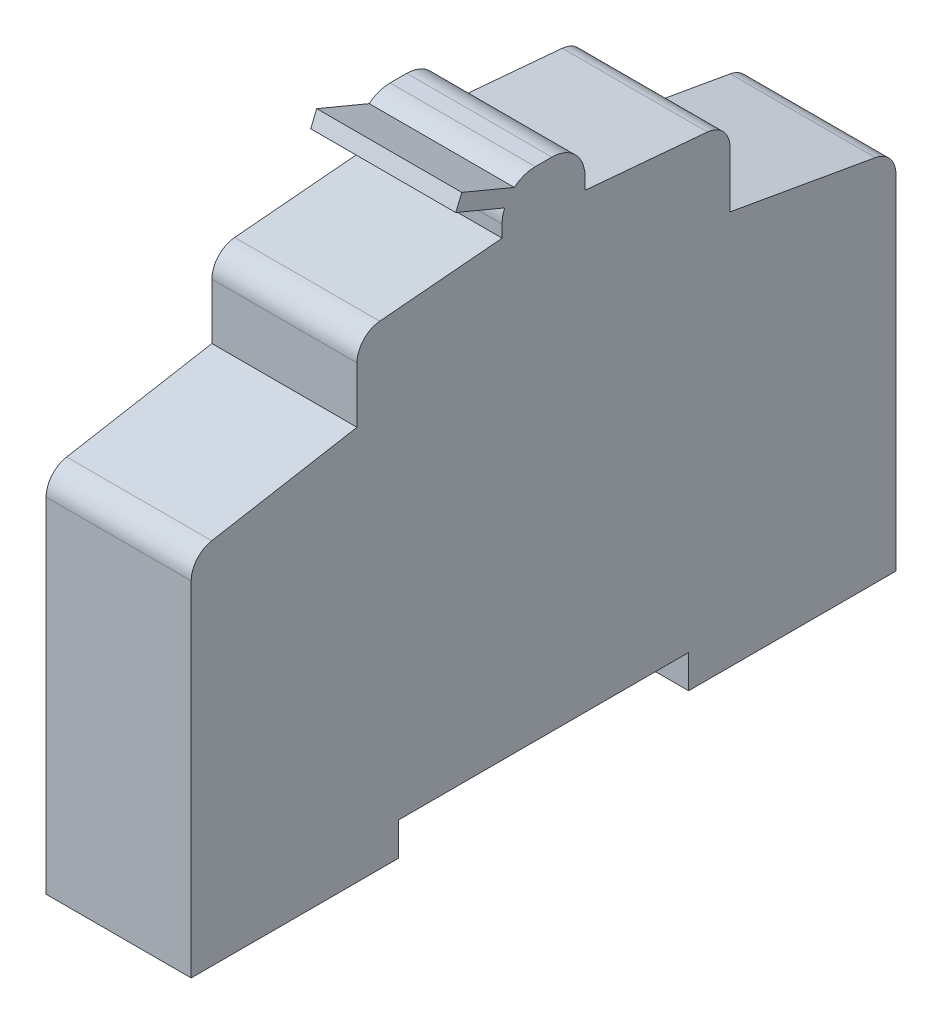
ISO-10303-21;
HEADER;
FILE_DESCRIPTION(('STEP AP214'),'2;1');
FILE_NAME('part.step','',(''),(''),'','','');
FILE_SCHEMA(('AUTOMOTIVE_DESIGN { 1 0 10303 214 1 1 1 1 }'));
ENDSEC;
DATA;
#1=APPLICATION_CONTEXT('core data for automotive mechanical design processes');
#2=APPLICATION_PROTOCOL_DEFINITION('international standard','automotive_design',2000,#1);
#3=PRODUCT_CONTEXT('',#1,'mechanical');
#4=PRODUCT('Part','Part','',(#3));
#5=PRODUCT_RELATED_PRODUCT_CATEGORY('part','',(#4));
#6=PRODUCT_DEFINITION_FORMATION('','',#4);
#7=PRODUCT_DEFINITION_CONTEXT('part definition',#1,'design');
#8=PRODUCT_DEFINITION('design','',#6,#7);
#9=PRODUCT_DEFINITION_SHAPE('','',#8);
#10=(LENGTH_UNIT() NAMED_UNIT(*) SI_UNIT(.MILLI.,.METRE.));
#11=(NAMED_UNIT(*) PLANE_ANGLE_UNIT() SI_UNIT($,.RADIAN.));
#12=(NAMED_UNIT(*) SI_UNIT($,.STERADIAN.) SOLID_ANGLE_UNIT());
#13=UNCERTAINTY_MEASURE_WITH_UNIT(LENGTH_MEASURE(1.E-05),#10,'distance_accuracy_value','');
#14=(GEOMETRIC_REPRESENTATION_CONTEXT(3) GLOBAL_UNCERTAINTY_ASSIGNED_CONTEXT((#13)) GLOBAL_UNIT_ASSIGNED_CONTEXT((#10,
#11,#12)) REPRESENTATION_CONTEXT('',''));
#15=CARTESIAN_POINT('',(0.,0.,0.));
#16=DIRECTION('',(0.,0.,1.));
#17=DIRECTION('',(1.,0.,0.));
#18=AXIS2_PLACEMENT_3D('',#15,#16,#17);
#19=CARTESIAN_POINT('',(0.,0.,0.));
#20=DIRECTION('',(0.,-1.,0.));
#21=DIRECTION('',(0.,0.,-1.));
#22=AXIS2_PLACEMENT_3D('',#19,#20,#21);
#23=PLANE('',#22);
#24=DIRECTION('',(1.,0.,0.));
#25=VECTOR('',#24,1.);
#26=CARTESIAN_POINT('',(-0.001000000000001,0.,-25.));
#27=LINE('',#26,#25);
#28=CARTESIAN_POINT('',(0.,0.,-25.));
#29=VERTEX_POINT('',#28);
#30=CARTESIAN_POINT('',(17.5,0.,-25.));
#31=VERTEX_POINT('',#30);
#32=EDGE_CURVE('E397',#29,#31,#27,.T.);
#33=ORIENTED_EDGE('',*,*,#32,.T.);
#34=DIRECTION('',(0.,0.,-1.));
#35=VECTOR('',#34,1.);
#36=CARTESIAN_POINT('',(17.5,0.,0.));
#37=LINE('',#36,#35);
#38=CARTESIAN_POINT('',(17.5,0.,0.));
#39=VERTEX_POINT('',#38);
#40=EDGE_CURVE('E232',#39,#31,#37,.T.);
#41=ORIENTED_EDGE('',*,*,#40,.F.);
#42=DIRECTION('',(1.,0.,0.));
#43=VECTOR('',#42,1.);
#44=CARTESIAN_POINT('',(0.,0.,0.));
#45=LINE('',#44,#43);
#46=CARTESIAN_POINT('',(0.,0.,0.));
#47=VERTEX_POINT('',#46);
#48=EDGE_CURVE('E233',#47,#39,#45,.T.);
#49=ORIENTED_EDGE('',*,*,#48,.F.);
#50=DIRECTION('',(0.,0.,1.));
#51=VECTOR('',#50,1.);
#52=CARTESIAN_POINT('',(0.,0.,0.));
#53=LINE('',#52,#51);
#54=EDGE_CURVE('E380',#29,#47,#53,.T.);
#55=ORIENTED_EDGE('',*,*,#54,.F.);
#56=EDGE_LOOP('',(#33,#41,#49,#55));
#57=FACE_BOUND('',#56,.T.);
#58=ADVANCED_FACE('F36',(#57),#23,.T.);
#59=CARTESIAN_POINT('',(0.,60.,-41.5));
#60=DIRECTION('',(-1.,0.,0.));
#61=DIRECTION('',(0.,0.,1.));
#62=AXIS2_PLACEMENT_3D('',#59,#60,#61);
#63=CYLINDRICAL_SURFACE('',#62,4.);
#64=DIRECTION('',(-1.,0.,0.));
#65=VECTOR('',#64,1.);
#66=CARTESIAN_POINT('',(0.,63.0996030883576,-38.9716683970167));
#67=LINE('',#66,#65);
#68=CARTESIAN_POINT('',(17.5,63.0996030883576,-38.9716683970167));
#69=VERTEX_POINT('',#68);
#70=CARTESIAN_POINT('',(0.,63.0996030883576,-38.9716683970167));
#71=VERTEX_POINT('',#70);
#72=EDGE_CURVE('E11',#69,#71,#67,.T.);
#73=ORIENTED_EDGE('',*,*,#72,.F.);
#74=CARTESIAN_POINT('',(17.5,60.,-41.5));
#75=DIRECTION('',(-1.,0.,0.));
#76=DIRECTION('',(0.,0.,1.));
#77=AXIS2_PLACEMENT_3D('',#74,#75,#76);
#78=CIRCLE('',#77,4.);
#79=CARTESIAN_POINT('',(17.5,64.,-41.5));
#80=VERTEX_POINT('',#79);
#81=EDGE_CURVE('E331',#80,#69,#78,.F.);
#82=ORIENTED_EDGE('',*,*,#81,.F.);
#83=DIRECTION('',(1.,0.,0.));
#84=VECTOR('',#83,1.);
#85=CARTESIAN_POINT('',(17.5,64.,-41.5));
#86=LINE('',#85,#84);
#87=CARTESIAN_POINT('',(0.,64.,-41.5));
#88=VERTEX_POINT('',#87);
#89=EDGE_CURVE('E325',#88,#80,#86,.T.);
#90=ORIENTED_EDGE('',*,*,#89,.F.);
#91=CARTESIAN_POINT('',(0.,60.,-41.5));
#92=DIRECTION('',(1.,0.,0.));
#93=DIRECTION('',(0.,0.,-1.));
#94=AXIS2_PLACEMENT_3D('',#91,#92,#93);
#95=CIRCLE('',#94,4.);
#96=EDGE_CURVE('E338',#71,#88,#95,.F.);
#97=ORIENTED_EDGE('',*,*,#96,.F.);
#98=EDGE_LOOP('',(#73,#82,#90,#97));
#99=FACE_BOUND('',#98,.T.);
#100=ADVANCED_FACE('F430',(#99),#63,.T.);
#101=CARTESIAN_POINT('',(0.,44.,0.));
#102=DIRECTION('',(1.,0.,0.));
#103=DIRECTION('',(0.,0.,-1.));
#104=AXIS2_PLACEMENT_3D('',#101,#102,#103);
#105=PLANE('',#104);
#106=DIRECTION('',(0.,0.,-1.));
#107=VECTOR('',#106,1.);
#108=CARTESIAN_POINT('',(0.,4.,-60.));
#109=LINE('',#108,#107);
#110=CARTESIAN_POINT('',(0.,4.,-25.));
#111=VERTEX_POINT('',#110);
#112=CARTESIAN_POINT('',(0.,4.,-60.));
#113=VERTEX_POINT('',#112);
#114=EDGE_CURVE('E682',#111,#113,#109,.T.);
#115=ORIENTED_EDGE('',*,*,#114,.F.);
#116=DIRECTION('',(0.,1.,0.));
#117=VECTOR('',#116,1.);
#118=CARTESIAN_POINT('',(0.,4.,-25.));
#119=LINE('',#118,#117);
#120=EDGE_CURVE('E226',#29,#111,#119,.T.);
#121=ORIENTED_EDGE('',*,*,#120,.F.);
#122=ORIENTED_EDGE('',*,*,#54,.T.);
#123=DIRECTION('',(0.,-1.,0.));
#124=VECTOR('',#123,1.);
#125=CARTESIAN_POINT('',(0.,44.,0.));
#126=LINE('',#125,#124);
#127=CARTESIAN_POINT('',(0.,41.4827011064681,0.));
#128=VERTEX_POINT('',#127);
#129=EDGE_CURVE('E247',#128,#47,#126,.T.);
#130=ORIENTED_EDGE('',*,*,#129,.F.);
#131=CARTESIAN_POINT('',(0.,41.4827011064681,-3.));
#132=DIRECTION('',(1.,0.,0.));
#133=DIRECTION('',(0.,0.,-1.));
#134=AXIS2_PLACEMENT_3D('',#131,#132,#133);
#135=CIRCLE('',#134,3.);
#136=CARTESIAN_POINT('',(0.,44.4371243655047,-2.4790554669992));
#137=VERTEX_POINT('',#136);
#138=EDGE_CURVE('E305',#128,#137,#135,.F.);
#139=ORIENTED_EDGE('',*,*,#138,.T.);
#140=DIRECTION('',(0.,-0.173648177666934,0.984807753012207));
#141=VECTOR('',#140,1.);
#142=CARTESIAN_POINT('',(0.,43.9999999999999,0.));
#143=LINE('',#142,#141);
#144=CARTESIAN_POINT('',(0.,47.5265396141693,-20.));
#145=VERTEX_POINT('',#144);
#146=EDGE_CURVE('E265',#137,#145,#143,.F.);
#147=ORIENTED_EDGE('',*,*,#146,.T.);
#148=DIRECTION('',(0.,-1.,0.));
#149=VECTOR('',#148,1.);
#150=CARTESIAN_POINT('',(0.,59.,-20.));
#151=LINE('',#150,#149);
#152=CARTESIAN_POINT('',(0.,54.2510064779476,-20.));
#153=VERTEX_POINT('',#152);
#154=EDGE_CURVE('E379',#153,#145,#151,.T.);
#155=ORIENTED_EDGE('',*,*,#154,.F.);
#156=CARTESIAN_POINT('',(0.,54.2510064779476,-23.));
#157=DIRECTION('',(1.,0.,0.));
#158=DIRECTION('',(0.,0.,-1.));
#159=AXIS2_PLACEMENT_3D('',#156,#157,#158);
#160=CIRCLE('',#159,3.);
#161=CARTESIAN_POINT('',(0.,57.2395905722228,-22.738532771757));
#162=VERTEX_POINT('',#161);
#163=EDGE_CURVE('E303',#153,#162,#160,.F.);
#164=ORIENTED_EDGE('',*,*,#163,.T.);
#165=DIRECTION('',(0.,0.087155742747655,-0.996194698091746));
#166=VECTOR('',#165,1.);
#167=CARTESIAN_POINT('',(0.,59.,-42.8601046055254));
#168=LINE('',#167,#166);
#169=CARTESIAN_POINT('',(0.,58.5310516117034,-37.5));
#170=VERTEX_POINT('',#169);
#171=EDGE_CURVE('E280',#162,#170,#168,.T.);
#172=ORIENTED_EDGE('',*,*,#171,.T.);
#173=DIRECTION('',(0.,-1.,0.));
#174=VECTOR('',#173,1.);
#175=CARTESIAN_POINT('',(0.,64.,-37.5));
#176=LINE('',#175,#174);
#177=CARTESIAN_POINT('',(0.,60.,-37.5));
#178=VERTEX_POINT('',#177);
#179=EDGE_CURVE('E360',#178,#170,#176,.T.);
#180=ORIENTED_EDGE('',*,*,#179,.F.);
#181=CARTESIAN_POINT('',(0.,61.5405482061111,-37.8085624447042));
#182=VERTEX_POINT('',#181);
#183=EDGE_CURVE('E339',#178,#182,#95,.F.);
#184=ORIENTED_EDGE('',*,*,#183,.T.);
#185=DIRECTION('',(0.,0.385137051527772,0.922859388823939));
#186=VECTOR('',#185,1.);
#187=CARTESIAN_POINT('',(0.,61.5405482061111,-37.8085624447042));
#188=LINE('',#187,#186);
#189=CARTESIAN_POINT('',(0.,64.,-31.9152624613693));
#190=VERTEX_POINT('',#189);
#191=EDGE_CURVE('E348',#182,#190,#188,.T.);
#192=ORIENTED_EDGE('',*,*,#191,.T.);
#193=DIRECTION('',(0.,0.922859388823939,-0.385137051527773));
#194=VECTOR('',#193,1.);
#195=CARTESIAN_POINT('',(0.,64.,-31.9152624613693));
#196=LINE('',#195,#194);
#197=CARTESIAN_POINT('',(0.,65.7411990758896,-32.6419173411182));
#198=VERTEX_POINT('',#197);
#199=EDGE_CURVE('E669',#190,#198,#196,.T.);
#200=ORIENTED_EDGE('',*,*,#199,.T.);
#201=DIRECTION('',(0.,-0.38513705152777,-0.92285938882394));
#202=VECTOR('',#201,1.);
#203=CARTESIAN_POINT('',(0.,65.7411990758896,-32.6419173411182));
#204=LINE('',#203,#202);
#205=EDGE_CURVE('E658',#198,#71,#204,.T.);
#206=ORIENTED_EDGE('',*,*,#205,.T.);
#207=ORIENTED_EDGE('',*,*,#96,.T.);
#208=DIRECTION('',(0.,0.,1.));
#209=VECTOR('',#208,1.);
#210=CARTESIAN_POINT('',(0.,64.,-42.5));
#211=LINE('',#210,#209);
#212=CARTESIAN_POINT('',(0.,64.,-43.5));
#213=VERTEX_POINT('',#212);
#214=EDGE_CURVE('E361',#213,#88,#211,.T.);
#215=ORIENTED_EDGE('',*,*,#214,.F.);
#216=CARTESIAN_POINT('',(0.,60.,-43.5));
#217=DIRECTION('',(1.,0.,0.));
#218=DIRECTION('',(0.,0.,-1.));
#219=AXIS2_PLACEMENT_3D('',#216,#217,#218);
#220=CIRCLE('',#219,4.);
#221=CARTESIAN_POINT('',(0.,60.,-47.5));
#222=VERTEX_POINT('',#221);
#223=EDGE_CURVE('E336',#213,#222,#220,.F.);
#224=ORIENTED_EDGE('',*,*,#223,.T.);
#225=DIRECTION('',(0.,-1.,0.));
#226=VECTOR('',#225,1.);
#227=CARTESIAN_POINT('',(0.,64.,-47.5));
#228=LINE('',#227,#226);
#229=CARTESIAN_POINT('',(0.,58.5310516117035,-47.5));
#230=VERTEX_POINT('',#229);
#231=EDGE_CURVE('E363',#222,#230,#228,.T.);
#232=ORIENTED_EDGE('',*,*,#231,.T.);
#233=DIRECTION('',(0.,-0.087155742747655,-0.996194698091746));
#234=VECTOR('',#233,1.);
#235=CARTESIAN_POINT('',(0.,59.,-42.1398953944746));
#236=LINE('',#235,#234);
#237=CARTESIAN_POINT('',(0.,57.2395905722228,-62.261467228243));
#238=VERTEX_POINT('',#237);
#239=EDGE_CURVE('E268',#230,#238,#236,.T.);
#240=ORIENTED_EDGE('',*,*,#239,.T.);
#241=CARTESIAN_POINT('',(0.,54.2510064779476,-62.));
#242=DIRECTION('',(1.,0.,0.));
#243=DIRECTION('',(0.,0.,-1.));
#244=AXIS2_PLACEMENT_3D('',#241,#242,#243);
#245=CIRCLE('',#244,3.);
#246=CARTESIAN_POINT('',(0.,54.2510064779476,-65.));
#247=VERTEX_POINT('',#246);
#248=EDGE_CURVE('E301',#238,#247,#245,.F.);
#249=ORIENTED_EDGE('',*,*,#248,.T.);
#250=DIRECTION('',(0.,-1.,0.));
#251=VECTOR('',#250,1.);
#252=CARTESIAN_POINT('',(0.,59.,-65.));
#253=LINE('',#252,#251);
#254=CARTESIAN_POINT('',(0.,47.5265396141693,-65.));
#255=VERTEX_POINT('',#254);
#256=EDGE_CURVE('E373',#247,#255,#253,.T.);
#257=ORIENTED_EDGE('',*,*,#256,.T.);
#258=DIRECTION('',(0.,0.173648177666934,0.984807753012207));
#259=VECTOR('',#258,1.);
#260=CARTESIAN_POINT('',(0.,58.5358560913412,-2.56306361659899));
#261=LINE('',#260,#259);
#262=CARTESIAN_POINT('',(0.,44.4371243655047,-82.5209445330008));
#263=VERTEX_POINT('',#262);
#264=EDGE_CURVE('E253',#255,#263,#261,.F.);
#265=ORIENTED_EDGE('',*,*,#264,.T.);
#266=CARTESIAN_POINT('',(0.,41.4827011064681,-82.));
#267=DIRECTION('',(1.,0.,0.));
#268=DIRECTION('',(0.,0.,-1.));
#269=AXIS2_PLACEMENT_3D('',#266,#267,#268);
#270=CIRCLE('',#269,3.);
#271=CARTESIAN_POINT('',(0.,41.4827011064681,-85.));
#272=VERTEX_POINT('',#271);
#273=EDGE_CURVE('E299',#263,#272,#270,.F.);
#274=ORIENTED_EDGE('',*,*,#273,.T.);
#275=DIRECTION('',(0.,-1.,0.));
#276=VECTOR('',#275,1.);
#277=CARTESIAN_POINT('',(0.,44.,-85.));
#278=LINE('',#277,#276);
#279=CARTESIAN_POINT('',(0.,0.,-85.));
#280=VERTEX_POINT('',#279);
#281=EDGE_CURVE('E241',#272,#280,#278,.T.);
#282=ORIENTED_EDGE('',*,*,#281,.T.);
#283=CARTESIAN_POINT('',(0.,0.,-60.));
#284=VERTEX_POINT('',#283);
#285=EDGE_CURVE('E236',#280,#284,#53,.T.);
#286=ORIENTED_EDGE('',*,*,#285,.T.);
#287=DIRECTION('',(0.,-1.,0.));
#288=VECTOR('',#287,1.);
#289=CARTESIAN_POINT('',(0.,0.,-60.));
#290=LINE('',#289,#288);
#291=EDGE_CURVE('E51',#113,#284,#290,.T.);
#292=ORIENTED_EDGE('',*,*,#291,.F.);
#293=EDGE_LOOP('',(#115,#121,#122,#130,#139,#147,#155,#164,#172,#180,#184,#192,#200,#206,#207,
#215,#224,#232,#240,#249,#257,#265,#274,#282,#286,#292));
#294=FACE_BOUND('',#293,.T.);
#295=ADVANCED_FACE('F386',(#294),#105,.F.);
#296=CARTESIAN_POINT('',(0.,44.,0.));
#297=DIRECTION('',(0.,0.,-1.));
#298=DIRECTION('',(-1.,0.,0.));
#299=AXIS2_PLACEMENT_3D('',#296,#297,#298);
#300=PLANE('',#299);
#301=DIRECTION('',(0.,-1.,0.));
#302=VECTOR('',#301,1.);
#303=CARTESIAN_POINT('',(17.5,44.,0.));
#304=LINE('',#303,#302);
#305=CARTESIAN_POINT('',(17.5,41.4827011064681,0.));
#306=VERTEX_POINT('',#305);
#307=EDGE_CURVE('E245',#306,#39,#304,.T.);
#308=ORIENTED_EDGE('',*,*,#307,.F.);
#309=DIRECTION('',(-1.,0.,0.));
#310=VECTOR('',#309,1.);
#311=CARTESIAN_POINT('',(0.,41.4827011064681,0.));
#312=LINE('',#311,#310);
#313=EDGE_CURVE('E297',#306,#128,#312,.T.);
#314=ORIENTED_EDGE('',*,*,#313,.T.);
#315=ORIENTED_EDGE('',*,*,#129,.T.);
#316=ORIENTED_EDGE('',*,*,#48,.T.);
#317=EDGE_LOOP('',(#308,#314,#315,#316));
#318=FACE_BOUND('',#317,.T.);
#319=ADVANCED_FACE('F394',(#318),#300,.F.);
#320=CARTESIAN_POINT('',(17.5,44.,0.));
#321=DIRECTION('',(-1.,0.,0.));
#322=DIRECTION('',(0.,0.,1.));
#323=AXIS2_PLACEMENT_3D('',#320,#321,#322);
#324=PLANE('',#323);
#325=ORIENTED_EDGE('',*,*,#40,.T.);
#326=DIRECTION('',(0.,-1.,0.));
#327=VECTOR('',#326,1.);
#328=CARTESIAN_POINT('',(17.5,4.,-25.));
#329=LINE('',#328,#327);
#330=CARTESIAN_POINT('',(17.5,4.,-25.));
#331=VERTEX_POINT('',#330);
#332=EDGE_CURVE('E216',#331,#31,#329,.T.);
#333=ORIENTED_EDGE('',*,*,#332,.F.);
#334=DIRECTION('',(0.,0.,1.));
#335=VECTOR('',#334,1.);
#336=CARTESIAN_POINT('',(17.5,4.,-60.));
#337=LINE('',#336,#335);
#338=CARTESIAN_POINT('',(17.5,4.,-60.));
#339=VERTEX_POINT('',#338);
#340=EDGE_CURVE('E225',#339,#331,#337,.T.);
#341=ORIENTED_EDGE('',*,*,#340,.F.);
#342=DIRECTION('',(0.,1.,0.));
#343=VECTOR('',#342,1.);
#344=CARTESIAN_POINT('',(17.5,0.,-60.));
#345=LINE('',#344,#343);
#346=CARTESIAN_POINT('',(17.5,0.,-60.));
#347=VERTEX_POINT('',#346);
#348=EDGE_CURVE('E209',#347,#339,#345,.T.);
#349=ORIENTED_EDGE('',*,*,#348,.F.);
#350=CARTESIAN_POINT('',(17.5,0.,-85.));
#351=VERTEX_POINT('',#350);
#352=EDGE_CURVE('E221',#347,#351,#37,.T.);
#353=ORIENTED_EDGE('',*,*,#352,.T.);
#354=DIRECTION('',(0.,-1.,0.));
#355=VECTOR('',#354,1.);
#356=CARTESIAN_POINT('',(17.5,44.,-85.));
#357=LINE('',#356,#355);
#358=CARTESIAN_POINT('',(17.5,41.4827011064681,-85.));
#359=VERTEX_POINT('',#358);
#360=EDGE_CURVE('E243',#359,#351,#357,.T.);
#361=ORIENTED_EDGE('',*,*,#360,.F.);
#362=CARTESIAN_POINT('',(17.5,41.4827011064681,-82.));
#363=DIRECTION('',(-1.,0.,0.));
#364=DIRECTION('',(0.,0.,1.));
#365=AXIS2_PLACEMENT_3D('',#362,#363,#364);
#366=CIRCLE('',#365,3.);
#367=CARTESIAN_POINT('',(17.5,44.4371243655047,-82.5209445330008));
#368=VERTEX_POINT('',#367);
#369=EDGE_CURVE('E289',#359,#368,#366,.F.);
#370=ORIENTED_EDGE('',*,*,#369,.T.);
#371=DIRECTION('',(0.,-0.173648177666934,-0.984807753012207));
#372=VECTOR('',#371,1.);
#373=CARTESIAN_POINT('',(17.5,58.5358560913412,-2.56306361659899));
#374=LINE('',#373,#372);
#375=CARTESIAN_POINT('',(17.5,47.5265396141693,-65.));
#376=VERTEX_POINT('',#375);
#377=EDGE_CURVE('E256',#368,#376,#374,.F.);
#378=ORIENTED_EDGE('',*,*,#377,.T.);
#379=DIRECTION('',(0.,-1.,0.));
#380=VECTOR('',#379,1.);
#381=CARTESIAN_POINT('',(17.5,59.,-65.));
#382=LINE('',#381,#380);
#383=CARTESIAN_POINT('',(17.5,54.2510064779476,-65.));
#384=VERTEX_POINT('',#383);
#385=EDGE_CURVE('E375',#384,#376,#382,.T.);
#386=ORIENTED_EDGE('',*,*,#385,.F.);
#387=CARTESIAN_POINT('',(17.5,54.2510064779476,-62.));
#388=DIRECTION('',(-1.,0.,0.));
#389=DIRECTION('',(0.,0.,1.));
#390=AXIS2_PLACEMENT_3D('',#387,#388,#389);
#391=CIRCLE('',#390,3.);
#392=CARTESIAN_POINT('',(17.5,57.2395905722228,-62.261467228243));
#393=VERTEX_POINT('',#392);
#394=EDGE_CURVE('E291',#384,#393,#391,.F.);
#395=ORIENTED_EDGE('',*,*,#394,.T.);
#396=DIRECTION('',(0.,0.087155742747655,0.996194698091746));
#397=VECTOR('',#396,1.);
#398=CARTESIAN_POINT('',(17.5,59.,-42.1398953944746));
#399=LINE('',#398,#397);
#400=CARTESIAN_POINT('',(17.5,58.5310516117035,-47.5));
#401=VERTEX_POINT('',#400);
#402=EDGE_CURVE('E271',#393,#401,#399,.T.);
#403=ORIENTED_EDGE('',*,*,#402,.T.);
#404=DIRECTION('',(0.,-1.,0.));
#405=VECTOR('',#404,1.);
#406=CARTESIAN_POINT('',(17.5,64.,-47.5));
#407=LINE('',#406,#405);
#408=CARTESIAN_POINT('',(17.5,60.,-47.5));
#409=VERTEX_POINT('',#408);
#410=EDGE_CURVE('E371',#409,#401,#407,.T.);
#411=ORIENTED_EDGE('',*,*,#410,.F.);
#412=CARTESIAN_POINT('',(17.5,60.,-43.5));
#413=DIRECTION('',(-1.,0.,0.));
#414=DIRECTION('',(0.,0.,1.));
#415=AXIS2_PLACEMENT_3D('',#412,#413,#414);
#416=CIRCLE('',#415,4.);
#417=CARTESIAN_POINT('',(17.5,64.,-43.5));
#418=VERTEX_POINT('',#417);
#419=EDGE_CURVE('E328',#409,#418,#416,.F.);
#420=ORIENTED_EDGE('',*,*,#419,.T.);
#421=DIRECTION('',(0.,0.,-1.));
#422=VECTOR('',#421,1.);
#423=CARTESIAN_POINT('',(17.5,64.,-42.5));
#424=LINE('',#423,#422);
#425=EDGE_CURVE('E366',#80,#418,#424,.T.);
#426=ORIENTED_EDGE('',*,*,#425,.F.);
#427=ORIENTED_EDGE('',*,*,#81,.T.);
#428=DIRECTION('',(0.,0.38513705152777,0.92285938882394));
#429=VECTOR('',#428,1.);
#430=CARTESIAN_POINT('',(17.5,65.7411990758896,-32.6419173411182));
#431=LINE('',#430,#429);
#432=CARTESIAN_POINT('',(17.5,65.7411990758896,-32.6419173411182));
#433=VERTEX_POINT('',#432);
#434=EDGE_CURVE('E660',#69,#433,#431,.T.);
#435=ORIENTED_EDGE('',*,*,#434,.T.);
#436=DIRECTION('',(0.,-0.922859388823939,0.385137051527773));
#437=VECTOR('',#436,1.);
#438=CARTESIAN_POINT('',(17.5,64.,-31.9152624613693));
#439=LINE('',#438,#437);
#440=CARTESIAN_POINT('',(17.5,64.,-31.9152624613693));
#441=VERTEX_POINT('',#440);
#442=EDGE_CURVE('E667',#433,#441,#439,.T.);
#443=ORIENTED_EDGE('',*,*,#442,.T.);
#444=DIRECTION('',(0.,-0.385137051527772,-0.922859388823939));
#445=VECTOR('',#444,1.);
#446=CARTESIAN_POINT('',(17.5,61.5405482061111,-37.8085624447042));
#447=LINE('',#446,#445);
#448=CARTESIAN_POINT('',(17.5,61.5405482061111,-37.8085624447042));
#449=VERTEX_POINT('',#448);
#450=EDGE_CURVE('E59',#441,#449,#447,.T.);
#451=ORIENTED_EDGE('',*,*,#450,.T.);
#452=CARTESIAN_POINT('',(17.5,60.,-37.5));
#453=VERTEX_POINT('',#452);
#454=EDGE_CURVE('E330',#449,#453,#78,.F.);
#455=ORIENTED_EDGE('',*,*,#454,.T.);
#456=DIRECTION('',(0.,-1.,0.));
#457=VECTOR('',#456,1.);
#458=CARTESIAN_POINT('',(17.5,64.,-37.5));
#459=LINE('',#458,#457);
#460=CARTESIAN_POINT('',(17.5,58.5310516117035,-37.5));
#461=VERTEX_POINT('',#460);
#462=EDGE_CURVE('E354',#453,#461,#459,.T.);
#463=ORIENTED_EDGE('',*,*,#462,.T.);
#464=DIRECTION('',(0.,-0.087155742747655,0.996194698091746));
#465=VECTOR('',#464,1.);
#466=CARTESIAN_POINT('',(17.5,59.,-42.8601046055254));
#467=LINE('',#466,#465);
#468=CARTESIAN_POINT('',(17.5,57.2395905722228,-22.738532771757));
#469=VERTEX_POINT('',#468);
#470=EDGE_CURVE('E277',#461,#469,#467,.T.);
#471=ORIENTED_EDGE('',*,*,#470,.T.);
#472=CARTESIAN_POINT('',(17.5,54.2510064779476,-23.));
#473=DIRECTION('',(-1.,0.,0.));
#474=DIRECTION('',(0.,0.,1.));
#475=AXIS2_PLACEMENT_3D('',#472,#473,#474);
#476=CIRCLE('',#475,3.);
#477=CARTESIAN_POINT('',(17.5,54.2510064779476,-20.));
#478=VERTEX_POINT('',#477);
#479=EDGE_CURVE('E293',#469,#478,#476,.F.);
#480=ORIENTED_EDGE('',*,*,#479,.T.);
#481=DIRECTION('',(0.,-1.,0.));
#482=VECTOR('',#481,1.);
#483=CARTESIAN_POINT('',(17.5,59.,-20.));
#484=LINE('',#483,#482);
#485=CARTESIAN_POINT('',(17.5,47.5265396141693,-20.));
#486=VERTEX_POINT('',#485);
#487=EDGE_CURVE('E377',#478,#486,#484,.T.);
#488=ORIENTED_EDGE('',*,*,#487,.T.);
#489=DIRECTION('',(0.,0.173648177666934,-0.984807753012207));
#490=VECTOR('',#489,1.);
#491=CARTESIAN_POINT('',(17.5,43.9999999999999,0.));
#492=LINE('',#491,#490);
#493=CARTESIAN_POINT('',(17.5,44.4371243655047,-2.4790554669992));
#494=VERTEX_POINT('',#493);
#495=EDGE_CURVE('E262',#486,#494,#492,.F.);
#496=ORIENTED_EDGE('',*,*,#495,.T.);
#497=CARTESIAN_POINT('',(17.5,41.4827011064681,-3.));
#498=DIRECTION('',(-1.,0.,0.));
#499=DIRECTION('',(0.,0.,1.));
#500=AXIS2_PLACEMENT_3D('',#497,#498,#499);
#501=CIRCLE('',#500,3.);
#502=EDGE_CURVE('E295',#494,#306,#501,.F.);
#503=ORIENTED_EDGE('',*,*,#502,.T.);
#504=ORIENTED_EDGE('',*,*,#307,.T.);
#505=EDGE_LOOP('',(#325,#333,#341,#349,#353,#361,#370,#378,#386,#395,#403,#411,#420,#426,#427,
#435,#443,#451,#455,#463,#471,#480,#488,#496,#503,#504));
#506=FACE_BOUND('',#505,.T.);
#507=ADVANCED_FACE('F219',(#506),#324,.F.);
#508=CARTESIAN_POINT('',(0.,44.,-85.));
#509=DIRECTION('',(0.,0.,1.));
#510=DIRECTION('',(1.,0.,0.));
#511=AXIS2_PLACEMENT_3D('',#508,#509,#510);
#512=PLANE('',#511);
#513=ORIENTED_EDGE('',*,*,#281,.F.);
#514=DIRECTION('',(1.,0.,0.));
#515=VECTOR('',#514,1.);
#516=CARTESIAN_POINT('',(0.,41.4827011064681,-85.));
#517=LINE('',#516,#515);
#518=EDGE_CURVE('E320',#272,#359,#517,.T.);
#519=ORIENTED_EDGE('',*,*,#518,.T.);
#520=ORIENTED_EDGE('',*,*,#360,.T.);
#521=DIRECTION('',(-1.,0.,0.));
#522=VECTOR('',#521,1.);
#523=CARTESIAN_POINT('',(0.,0.,-85.));
#524=LINE('',#523,#522);
#525=EDGE_CURVE('E231',#351,#280,#524,.T.);
#526=ORIENTED_EDGE('',*,*,#525,.T.);
#527=EDGE_LOOP('',(#513,#519,#520,#526));
#528=FACE_BOUND('',#527,.T.);
#529=ADVANCED_FACE('F439',(#528),#512,.F.);
#530=DIRECTION('',(1.,0.,0.));
#531=VECTOR('',#530,1.);
#532=CARTESIAN_POINT('',(-0.001000000000001,0.,-60.));
#533=LINE('',#532,#531);
#534=EDGE_CURVE('E206',#284,#347,#533,.T.);
#535=ORIENTED_EDGE('',*,*,#534,.F.);
#536=ORIENTED_EDGE('',*,*,#285,.F.);
#537=ORIENTED_EDGE('',*,*,#525,.F.);
#538=ORIENTED_EDGE('',*,*,#352,.F.);
#539=EDGE_LOOP('',(#535,#536,#537,#538));
#540=FACE_BOUND('',#539,.T.);
#541=ADVANCED_FACE('F229',(#540),#23,.T.);
#542=CARTESIAN_POINT('',(0.,59.,-20.));
#543=DIRECTION('',(0.,0.,-1.));
#544=DIRECTION('',(-1.,0.,0.));
#545=AXIS2_PLACEMENT_3D('',#542,#543,#544);
#546=PLANE('',#545);
#547=ORIENTED_EDGE('',*,*,#487,.F.);
#548=DIRECTION('',(-1.,0.,0.));
#549=VECTOR('',#548,1.);
#550=CARTESIAN_POINT('',(0.,54.2510064779476,-20.));
#551=LINE('',#550,#549);
#552=EDGE_CURVE('E307',#478,#153,#551,.T.);
#553=ORIENTED_EDGE('',*,*,#552,.T.);
#554=ORIENTED_EDGE('',*,*,#154,.T.);
#555=DIRECTION('',(1.,0.,0.));
#556=VECTOR('',#555,1.);
#557=CARTESIAN_POINT('',(17.5,47.5265396141693,-20.));
#558=LINE('',#557,#556);
#559=EDGE_CURVE('E259',#145,#486,#558,.T.);
#560=ORIENTED_EDGE('',*,*,#559,.T.);
#561=EDGE_LOOP('',(#547,#553,#554,#560));
#562=FACE_BOUND('',#561,.T.);
#563=ADVANCED_FACE('F409',(#562),#546,.F.);
#564=CARTESIAN_POINT('',(0.,59.,-65.));
#565=DIRECTION('',(0.,0.,1.));
#566=DIRECTION('',(1.,0.,0.));
#567=AXIS2_PLACEMENT_3D('',#564,#565,#566);
#568=PLANE('',#567);
#569=ORIENTED_EDGE('',*,*,#256,.F.);
#570=DIRECTION('',(1.,0.,0.));
#571=VECTOR('',#570,1.);
#572=CARTESIAN_POINT('',(17.5,54.2510064779476,-65.));
#573=LINE('',#572,#571);
#574=EDGE_CURVE('E312',#247,#384,#573,.T.);
#575=ORIENTED_EDGE('',*,*,#574,.T.);
#576=ORIENTED_EDGE('',*,*,#385,.T.);
#577=DIRECTION('',(-1.,0.,0.));
#578=VECTOR('',#577,1.);
#579=CARTESIAN_POINT('',(0.,47.5265396141693,-65.));
#580=LINE('',#579,#578);
#581=EDGE_CURVE('E250',#376,#255,#580,.T.);
#582=ORIENTED_EDGE('',*,*,#581,.T.);
#583=EDGE_LOOP('',(#569,#575,#576,#582));
#584=FACE_BOUND('',#583,.T.);
#585=ADVANCED_FACE('F444',(#584),#568,.F.);
#586=CARTESIAN_POINT('',(17.5,64.,-47.5));
#587=DIRECTION('',(0.,0.,1.));
#588=DIRECTION('',(1.,0.,0.));
#589=AXIS2_PLACEMENT_3D('',#586,#587,#588);
#590=PLANE('',#589);
#591=ORIENTED_EDGE('',*,*,#231,.F.);
#592=DIRECTION('',(-1.,0.,0.));
#593=VECTOR('',#592,1.);
#594=CARTESIAN_POINT('',(17.5,60.,-47.5));
#595=LINE('',#594,#593);
#596=EDGE_CURVE('E342',#222,#409,#595,.F.);
#597=ORIENTED_EDGE('',*,*,#596,.T.);
#598=ORIENTED_EDGE('',*,*,#410,.T.);
#599=DIRECTION('',(-1.,0.,0.));
#600=VECTOR('',#599,1.);
#601=CARTESIAN_POINT('',(17.5,58.5310516117035,-47.5));
#602=LINE('',#601,#600);
#603=EDGE_CURVE('E274',#401,#230,#602,.T.);
#604=ORIENTED_EDGE('',*,*,#603,.T.);
#605=EDGE_LOOP('',(#591,#597,#598,#604));
#606=FACE_BOUND('',#605,.T.);
#607=ADVANCED_FACE('F503',(#606),#590,.F.);
#608=CARTESIAN_POINT('',(0.,64.,-37.5));
#609=DIRECTION('',(0.,0.,-1.));
#610=DIRECTION('',(-1.,0.,0.));
#611=AXIS2_PLACEMENT_3D('',#608,#609,#610);
#612=PLANE('',#611);
#613=ORIENTED_EDGE('',*,*,#462,.F.);
#614=DIRECTION('',(1.,0.,0.));
#615=VECTOR('',#614,1.);
#616=CARTESIAN_POINT('',(0.,60.,-37.5));
#617=LINE('',#616,#615);
#618=EDGE_CURVE('E334',#453,#178,#617,.F.);
#619=ORIENTED_EDGE('',*,*,#618,.T.);
#620=ORIENTED_EDGE('',*,*,#179,.T.);
#621=DIRECTION('',(1.,0.,0.));
#622=VECTOR('',#621,1.);
#623=CARTESIAN_POINT('',(0.,58.5310516117035,-37.5));
#624=LINE('',#623,#622);
#625=EDGE_CURVE('E283',#170,#461,#624,.T.);
#626=ORIENTED_EDGE('',*,*,#625,.T.);
#627=EDGE_LOOP('',(#613,#619,#620,#626));
#628=FACE_BOUND('',#627,.T.);
#629=ADVANCED_FACE('F356',(#628),#612,.F.);
#630=CARTESIAN_POINT('',(0.,64.,0.));
#631=DIRECTION('',(0.,1.,0.));
#632=DIRECTION('',(0.,0.,1.));
#633=AXIS2_PLACEMENT_3D('',#630,#631,#632);
#634=PLANE('',#633);
#635=ORIENTED_EDGE('',*,*,#214,.T.);
#636=ORIENTED_EDGE('',*,*,#89,.T.);
#637=ORIENTED_EDGE('',*,*,#425,.T.);
#638=DIRECTION('',(-1.,0.,0.));
#639=VECTOR('',#638,1.);
#640=CARTESIAN_POINT('',(0.,64.,-43.5));
#641=LINE('',#640,#639);
#642=EDGE_CURVE('E322',#418,#213,#641,.T.);
#643=ORIENTED_EDGE('',*,*,#642,.T.);
#644=EDGE_LOOP('',(#635,#636,#637,#643));
#645=FACE_BOUND('',#644,.T.);
#646=ADVANCED_FACE('F459',(#645),#634,.T.);
#647=CARTESIAN_POINT('',(0.,47.5265396141693,-65.));
#648=DIRECTION('',(0.,0.984807753012207,-0.173648177666934));
#649=DIRECTION('',(1.,0.,0.));
#650=AXIS2_PLACEMENT_3D('',#647,#648,#649);
#651=PLANE('',#650);
#652=ORIENTED_EDGE('',*,*,#377,.F.);
#653=DIRECTION('',(-1.,0.,0.));
#654=VECTOR('',#653,1.);
#655=CARTESIAN_POINT('',(0.,44.4371243655047,-82.5209445330008));
#656=LINE('',#655,#654);
#657=EDGE_CURVE('E317',#368,#263,#656,.T.);
#658=ORIENTED_EDGE('',*,*,#657,.T.);
#659=ORIENTED_EDGE('',*,*,#264,.F.);
#660=ORIENTED_EDGE('',*,*,#581,.F.);
#661=EDGE_LOOP('',(#652,#658,#659,#660));
#662=FACE_BOUND('',#661,.T.);
#663=ADVANCED_FACE('F456',(#662),#651,.T.);
#664=CARTESIAN_POINT('',(0.,47.5265396141693,-20.));
#665=DIRECTION('',(0.,0.984807753012207,0.173648177666934));
#666=DIRECTION('',(-1.,0.,0.));
#667=AXIS2_PLACEMENT_3D('',#664,#665,#666);
#668=PLANE('',#667);
#669=ORIENTED_EDGE('',*,*,#146,.F.);
#670=DIRECTION('',(1.,0.,0.));
#671=VECTOR('',#670,1.);
#672=CARTESIAN_POINT('',(0.,44.4371243655047,-2.47905546699919));
#673=LINE('',#672,#671);
#674=EDGE_CURVE('E286',#137,#494,#673,.T.);
#675=ORIENTED_EDGE('',*,*,#674,.T.);
#676=ORIENTED_EDGE('',*,*,#495,.F.);
#677=ORIENTED_EDGE('',*,*,#559,.F.);
#678=EDGE_LOOP('',(#669,#675,#676,#677));
#679=FACE_BOUND('',#678,.T.);
#680=ADVANCED_FACE('F405',(#679),#668,.T.);
#681=CARTESIAN_POINT('',(0.,59.,-42.1398953944746));
#682=DIRECTION('',(0.,0.996194698091746,-0.087155742747655));
#683=DIRECTION('',(1.,0.,0.));
#684=AXIS2_PLACEMENT_3D('',#681,#682,#683);
#685=PLANE('',#684);
#686=ORIENTED_EDGE('',*,*,#402,.F.);
#687=DIRECTION('',(1.,0.,0.));
#688=VECTOR('',#687,1.);
#689=CARTESIAN_POINT('',(0.,57.2395905722228,-62.261467228243));
#690=LINE('',#689,#688);
#691=EDGE_CURVE('E315',#393,#238,#690,.F.);
#692=ORIENTED_EDGE('',*,*,#691,.T.);
#693=ORIENTED_EDGE('',*,*,#239,.F.);
#694=ORIENTED_EDGE('',*,*,#603,.F.);
#695=EDGE_LOOP('',(#686,#692,#693,#694));
#696=FACE_BOUND('',#695,.T.);
#697=ADVANCED_FACE('F463',(#696),#685,.T.);
#698=CARTESIAN_POINT('',(0.,59.,-42.8601046055254));
#699=DIRECTION('',(0.,0.996194698091746,0.087155742747655));
#700=DIRECTION('',(-1.,0.,0.));
#701=AXIS2_PLACEMENT_3D('',#698,#699,#700);
#702=PLANE('',#701);
#703=ORIENTED_EDGE('',*,*,#171,.F.);
#704=DIRECTION('',(-1.,0.,0.));
#705=VECTOR('',#704,1.);
#706=CARTESIAN_POINT('',(17.5,57.2395905722228,-22.738532771757));
#707=LINE('',#706,#705);
#708=EDGE_CURVE('E310',#162,#469,#707,.F.);
#709=ORIENTED_EDGE('',*,*,#708,.T.);
#710=ORIENTED_EDGE('',*,*,#470,.F.);
#711=ORIENTED_EDGE('',*,*,#625,.F.);
#712=EDGE_LOOP('',(#703,#709,#710,#711));
#713=FACE_BOUND('',#712,.T.);
#714=ADVANCED_FACE('F415',(#713),#702,.T.);
#715=CARTESIAN_POINT('',(0.,41.4827011064681,-3.));
#716=DIRECTION('',(-1.,0.,0.));
#717=DIRECTION('',(0.,-1.,0.));
#718=AXIS2_PLACEMENT_3D('',#715,#716,#717);
#719=CYLINDRICAL_SURFACE('',#718,3.);
#720=ORIENTED_EDGE('',*,*,#138,.F.);
#721=ORIENTED_EDGE('',*,*,#313,.F.);
#722=ORIENTED_EDGE('',*,*,#502,.F.);
#723=ORIENTED_EDGE('',*,*,#674,.F.);
#724=EDGE_LOOP('',(#720,#721,#722,#723));
#725=FACE_BOUND('',#724,.T.);
#726=ADVANCED_FACE('F399',(#725),#719,.T.);
#727=CARTESIAN_POINT('',(0.,54.2510064779476,-23.));
#728=DIRECTION('',(1.,0.,0.));
#729=DIRECTION('',(0.,0.,-1.));
#730=AXIS2_PLACEMENT_3D('',#727,#728,#729);
#731=CYLINDRICAL_SURFACE('',#730,3.);
#732=ORIENTED_EDGE('',*,*,#479,.F.);
#733=ORIENTED_EDGE('',*,*,#708,.F.);
#734=ORIENTED_EDGE('',*,*,#163,.F.);
#735=ORIENTED_EDGE('',*,*,#552,.F.);
#736=EDGE_LOOP('',(#732,#733,#734,#735));
#737=FACE_BOUND('',#736,.T.);
#738=ADVANCED_FACE('F417',(#737),#731,.T.);
#739=CARTESIAN_POINT('',(0.,54.2510064779476,-62.));
#740=DIRECTION('',(-1.,0.,0.));
#741=DIRECTION('',(0.,0.,1.));
#742=AXIS2_PLACEMENT_3D('',#739,#740,#741);
#743=CYLINDRICAL_SURFACE('',#742,3.);
#744=ORIENTED_EDGE('',*,*,#248,.F.);
#745=ORIENTED_EDGE('',*,*,#691,.F.);
#746=ORIENTED_EDGE('',*,*,#394,.F.);
#747=ORIENTED_EDGE('',*,*,#574,.F.);
#748=EDGE_LOOP('',(#744,#745,#746,#747));
#749=FACE_BOUND('',#748,.T.);
#750=ADVANCED_FACE('F419',(#749),#743,.T.);
#751=CARTESIAN_POINT('',(0.,41.4827011064681,-82.));
#752=DIRECTION('',(1.,0.,0.));
#753=DIRECTION('',(0.,0.,-1.));
#754=AXIS2_PLACEMENT_3D('',#751,#752,#753);
#755=CYLINDRICAL_SURFACE('',#754,3.);
#756=ORIENTED_EDGE('',*,*,#369,.F.);
#757=ORIENTED_EDGE('',*,*,#518,.F.);
#758=ORIENTED_EDGE('',*,*,#273,.F.);
#759=ORIENTED_EDGE('',*,*,#657,.F.);
#760=EDGE_LOOP('',(#756,#757,#758,#759));
#761=FACE_BOUND('',#760,.T.);
#762=ADVANCED_FACE('F425',(#761),#755,.T.);
#763=DIRECTION('',(-1.,0.,0.));
#764=VECTOR('',#763,1.);
#765=CARTESIAN_POINT('',(0.,61.5405482061111,-37.8085624447042));
#766=LINE('',#765,#764);
#767=EDGE_CURVE('E44',#182,#449,#766,.F.);
#768=ORIENTED_EDGE('',*,*,#767,.F.);
#769=ORIENTED_EDGE('',*,*,#183,.F.);
#770=ORIENTED_EDGE('',*,*,#618,.F.);
#771=ORIENTED_EDGE('',*,*,#454,.F.);
#772=EDGE_LOOP('',(#768,#769,#770,#771));
#773=FACE_BOUND('',#772,.T.);
#774=ADVANCED_FACE('F352',(#773),#63,.T.);
#775=CARTESIAN_POINT('',(0.,60.,-43.5));
#776=DIRECTION('',(1.,0.,0.));
#777=DIRECTION('',(0.,0.,-1.));
#778=AXIS2_PLACEMENT_3D('',#775,#776,#777);
#779=CYLINDRICAL_SURFACE('',#778,4.);
#780=ORIENTED_EDGE('',*,*,#419,.F.);
#781=ORIENTED_EDGE('',*,*,#596,.F.);
#782=ORIENTED_EDGE('',*,*,#223,.F.);
#783=ORIENTED_EDGE('',*,*,#642,.F.);
#784=EDGE_LOOP('',(#780,#781,#782,#783));
#785=FACE_BOUND('',#784,.T.);
#786=ADVANCED_FACE('F38',(#785),#779,.T.);
#787=CARTESIAN_POINT('',(26.4267809584836,65.7411990758896,-32.6419173411182));
#788=DIRECTION('',(0.,0.92285938882394,-0.38513705152777));
#789=DIRECTION('',(0.,0.38513705152777,0.92285938882394));
#790=AXIS2_PLACEMENT_3D('',#787,#788,#789);
#791=PLANE('',#790);
#792=ORIENTED_EDGE('',*,*,#434,.F.);
#793=ORIENTED_EDGE('',*,*,#72,.T.);
#794=ORIENTED_EDGE('',*,*,#205,.F.);
#795=DIRECTION('',(-1.,0.,0.));
#796=VECTOR('',#795,1.);
#797=CARTESIAN_POINT('',(26.4267809584836,65.7411990758896,-32.6419173411182));
#798=LINE('',#797,#796);
#799=EDGE_CURVE('E665',#433,#198,#798,.T.);
#800=ORIENTED_EDGE('',*,*,#799,.F.);
#801=EDGE_LOOP('',(#792,#793,#794,#800));
#802=FACE_BOUND('',#801,.T.);
#803=ADVANCED_FACE('F537',(#802),#791,.T.);
#804=CARTESIAN_POINT('',(26.4267809584836,64.,-31.9152624613693));
#805=DIRECTION('',(0.,0.385137051527773,0.922859388823939));
#806=DIRECTION('',(0.,-0.922859388823939,0.385137051527773));
#807=AXIS2_PLACEMENT_3D('',#804,#805,#806);
#808=PLANE('',#807);
#809=ORIENTED_EDGE('',*,*,#442,.F.);
#810=ORIENTED_EDGE('',*,*,#799,.T.);
#811=ORIENTED_EDGE('',*,*,#199,.F.);
#812=DIRECTION('',(-1.,0.,0.));
#813=VECTOR('',#812,1.);
#814=CARTESIAN_POINT('',(26.4267809584836,64.,-31.9152624613693));
#815=LINE('',#814,#813);
#816=EDGE_CURVE('E663',#441,#190,#815,.T.);
#817=ORIENTED_EDGE('',*,*,#816,.F.);
#818=EDGE_LOOP('',(#809,#810,#811,#817));
#819=FACE_BOUND('',#818,.T.);
#820=ADVANCED_FACE('F558',(#819),#808,.T.);
#821=CARTESIAN_POINT('',(26.4267809584836,61.5405482061111,-37.8085624447042));
#822=DIRECTION('',(0.,-0.922859388823939,0.385137051527772));
#823=DIRECTION('',(0.,-0.385137051527772,-0.922859388823939));
#824=AXIS2_PLACEMENT_3D('',#821,#822,#823);
#825=PLANE('',#824);
#826=ORIENTED_EDGE('',*,*,#191,.F.);
#827=ORIENTED_EDGE('',*,*,#767,.T.);
#828=ORIENTED_EDGE('',*,*,#450,.F.);
#829=ORIENTED_EDGE('',*,*,#816,.T.);
#830=EDGE_LOOP('',(#826,#827,#828,#829));
#831=FACE_BOUND('',#830,.T.);
#832=ADVANCED_FACE('F346',(#831),#825,.T.);
#833=CARTESIAN_POINT('',(-0.001000000000001,4.,-25.));
#834=DIRECTION('',(0.,0.,1.));
#835=DIRECTION('',(1.,0.,0.));
#836=AXIS2_PLACEMENT_3D('',#833,#834,#835);
#837=PLANE('',#836);
#838=ORIENTED_EDGE('',*,*,#120,.T.);
#839=DIRECTION('',(1.,0.,0.));
#840=VECTOR('',#839,1.);
#841=CARTESIAN_POINT('',(-0.001000000000001,4.,-25.));
#842=LINE('',#841,#840);
#843=EDGE_CURVE('E676',#111,#331,#842,.T.);
#844=ORIENTED_EDGE('',*,*,#843,.T.);
#845=ORIENTED_EDGE('',*,*,#332,.T.);
#846=ORIENTED_EDGE('',*,*,#32,.F.);
#847=EDGE_LOOP('',(#838,#844,#845,#846));
#848=FACE_BOUND('',#847,.T.);
#849=ADVANCED_FACE('F578',(#848),#837,.F.);
#850=CARTESIAN_POINT('',(-0.001000000000001,4.,-60.));
#851=DIRECTION('',(0.,1.,0.));
#852=DIRECTION('',(0.,0.,1.));
#853=AXIS2_PLACEMENT_3D('',#850,#851,#852);
#854=PLANE('',#853);
#855=ORIENTED_EDGE('',*,*,#114,.T.);
#856=DIRECTION('',(1.,0.,0.));
#857=VECTOR('',#856,1.);
#858=CARTESIAN_POINT('',(-0.001000000000001,4.,-60.));
#859=LINE('',#858,#857);
#860=EDGE_CURVE('E215',#113,#339,#859,.T.);
#861=ORIENTED_EDGE('',*,*,#860,.T.);
#862=ORIENTED_EDGE('',*,*,#340,.T.);
#863=ORIENTED_EDGE('',*,*,#843,.F.);
#864=EDGE_LOOP('',(#855,#861,#862,#863));
#865=FACE_BOUND('',#864,.T.);
#866=ADVANCED_FACE('F609',(#865),#854,.F.);
#867=CARTESIAN_POINT('',(-0.001000000000001,0.,-60.));
#868=DIRECTION('',(0.,0.,-1.));
#869=DIRECTION('',(-1.,0.,0.));
#870=AXIS2_PLACEMENT_3D('',#867,#868,#869);
#871=PLANE('',#870);
#872=ORIENTED_EDGE('',*,*,#291,.T.);
#873=ORIENTED_EDGE('',*,*,#534,.T.);
#874=ORIENTED_EDGE('',*,*,#348,.T.);
#875=ORIENTED_EDGE('',*,*,#860,.F.);
#876=EDGE_LOOP('',(#872,#873,#874,#875));
#877=FACE_BOUND('',#876,.T.);
#878=ADVANCED_FACE('F208',(#877),#871,.F.);
#879=CLOSED_SHELL('',(#58,#100,#295,#319,#507,#529,#541,#563,#585,#607,#629,#646,#663,#680,#697,
#714,#726,#738,#750,#762,#774,#786,#803,#820,#832,#849,#866,#878));
#880=MANIFOLD_SOLID_BREP('B2',#879);
#881=ADVANCED_BREP_SHAPE_REPRESENTATION('',(#18,#880),#14);
#882=SHAPE_DEFINITION_REPRESENTATION(#9,#881);
ENDSEC;
END-ISO-10303-21;
